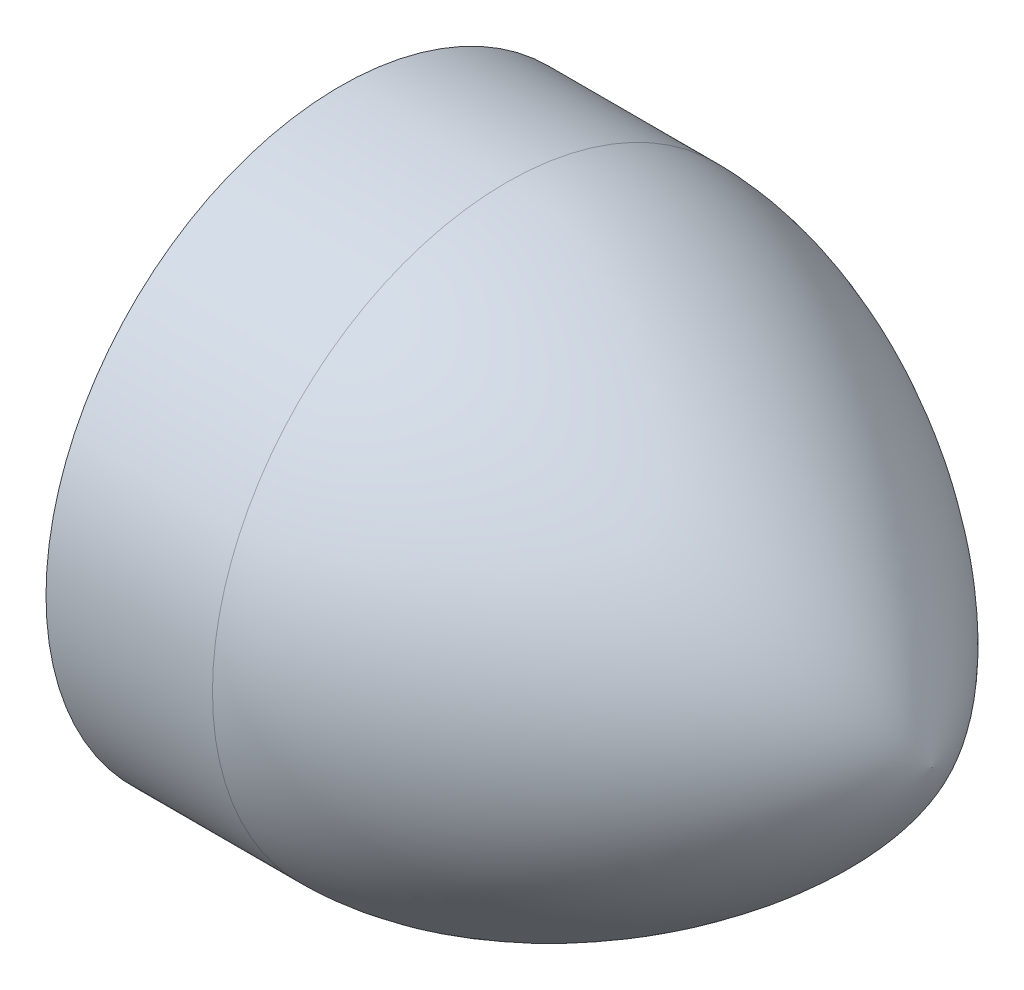
ISO-10303-21;
HEADER;
FILE_DESCRIPTION(('STEP AP214'),'2;1');
FILE_NAME('part.step','',(''),(''),'','','');
FILE_SCHEMA(('AUTOMOTIVE_DESIGN { 1 0 10303 214 1 1 1 1 }'));
ENDSEC;
DATA;
#1=APPLICATION_CONTEXT('core data for automotive mechanical design processes');
#2=APPLICATION_PROTOCOL_DEFINITION('international standard','automotive_design',2000,#1);
#3=PRODUCT_CONTEXT('',#1,'mechanical');
#4=PRODUCT('Part','Part','',(#3));
#5=PRODUCT_RELATED_PRODUCT_CATEGORY('part','',(#4));
#6=PRODUCT_DEFINITION_FORMATION('','',#4);
#7=PRODUCT_DEFINITION_CONTEXT('part definition',#1,'design');
#8=PRODUCT_DEFINITION('design','',#6,#7);
#9=PRODUCT_DEFINITION_SHAPE('','',#8);
#10=(LENGTH_UNIT() NAMED_UNIT(*) SI_UNIT(.MILLI.,.METRE.));
#11=(NAMED_UNIT(*) PLANE_ANGLE_UNIT() SI_UNIT($,.RADIAN.));
#12=(NAMED_UNIT(*) SI_UNIT($,.STERADIAN.) SOLID_ANGLE_UNIT());
#13=UNCERTAINTY_MEASURE_WITH_UNIT(LENGTH_MEASURE(1.E-05),#10,'distance_accuracy_value','');
#14=(GEOMETRIC_REPRESENTATION_CONTEXT(3) GLOBAL_UNCERTAINTY_ASSIGNED_CONTEXT((#13)) GLOBAL_UNIT_ASSIGNED_CONTEXT((#10,
#11,#12)) REPRESENTATION_CONTEXT('',''));
#15=CARTESIAN_POINT('',(0.,0.,0.));
#16=DIRECTION('',(0.,0.,1.));
#17=DIRECTION('',(1.,0.,0.));
#18=AXIS2_PLACEMENT_3D('',#15,#16,#17);
#19=CARTESIAN_POINT('',(20.3542229367724,0.,0.));
#20=CARTESIAN_POINT('',(19.4255385750418,4.1876756310068,0.));
#21=CARTESIAN_POINT('',(11.6575417439955,10.1448360970401,0.));
#22=CARTESIAN_POINT('',(5.72916350359824,10.1204740603662,0.));
#23=B_SPLINE_CURVE_WITH_KNOTS('',3,(#19,#20,#21,#22),.UNSPECIFIED.,.F.,.F.,(4,4),(0.,1.),.UNSPECIFIED.);
#24=CARTESIAN_POINT('',(0.,0.,0.));
#25=DIRECTION('',(-1.,0.,0.));
#26=AXIS1_PLACEMENT('',#24,#25);
#27=SURFACE_OF_REVOLUTION('',#23,#26);
#28=CARTESIAN_POINT('',(5.72916350359824,0.,0.));
#29=DIRECTION('',(-1.,0.,0.));
#30=DIRECTION('',(0.,0.,1.));
#31=AXIS2_PLACEMENT_3D('',#28,#29,#30);
#32=CIRCLE('',#31,10.1204740603662);
#33=CARTESIAN_POINT('',(5.72916350359824,0.,10.1204740603662));
#34=VERTEX_POINT('',#33);
#35=EDGE_CURVE('E11',#34,#34,#32,.T.);
#36=ORIENTED_EDGE('',*,*,#35,.F.);
#37=EDGE_LOOP('',(#36));
#38=FACE_BOUND('',#37,.T.);
#39=CARTESIAN_POINT('',(20.3542229367724,0.,0.));
#40=VERTEX_POINT('',#39);
#41=VERTEX_LOOP('',#40);
#42=FACE_BOUND('',#41,.T.);
#43=ADVANCED_FACE('F39',(#38,#42),#27,.T.);
#44=CARTESIAN_POINT('',(0.,0.,0.));
#45=DIRECTION('',(-1.,0.,0.));
#46=DIRECTION('',(0.,0.,1.));
#47=AXIS2_PLACEMENT_3D('',#44,#45,#46);
#48=CYLINDRICAL_SURFACE('',#47,10.1204740603662);
#49=CARTESIAN_POINT('',(0.,0.,0.));
#50=DIRECTION('',(-1.,0.,0.));
#51=DIRECTION('',(0.,0.,1.));
#52=AXIS2_PLACEMENT_3D('',#49,#50,#51);
#53=CIRCLE('',#52,10.1204740603662);
#54=CARTESIAN_POINT('',(0.,0.,10.1204740603662));
#55=VERTEX_POINT('',#54);
#56=EDGE_CURVE('E46',#55,#55,#53,.T.);
#57=ORIENTED_EDGE('',*,*,#56,.F.);
#58=EDGE_LOOP('',(#57));
#59=FACE_BOUND('',#58,.T.);
#60=ORIENTED_EDGE('',*,*,#35,.T.);
#61=EDGE_LOOP('',(#60));
#62=FACE_BOUND('',#61,.T.);
#63=ADVANCED_FACE('F50',(#59,#62),#48,.T.);
#64=CARTESIAN_POINT('',(0.,0.,0.));
#65=DIRECTION('',(1.,0.,0.));
#66=DIRECTION('',(0.,0.,-1.));
#67=AXIS2_PLACEMENT_3D('',#64,#65,#66);
#68=PLANE('',#67);
#69=ORIENTED_EDGE('',*,*,#56,.T.);
#70=EDGE_LOOP('',(#69));
#71=FACE_BOUND('',#70,.T.);
#72=ADVANCED_FACE('F55',(#71),#68,.F.);
#73=CLOSED_SHELL('',(#43,#63,#72));
#74=MANIFOLD_SOLID_BREP('B2',#73);
#75=ADVANCED_BREP_SHAPE_REPRESENTATION('',(#18,#74),#14);
#76=SHAPE_DEFINITION_REPRESENTATION(#9,#75);
ENDSEC;
END-ISO-10303-21;
